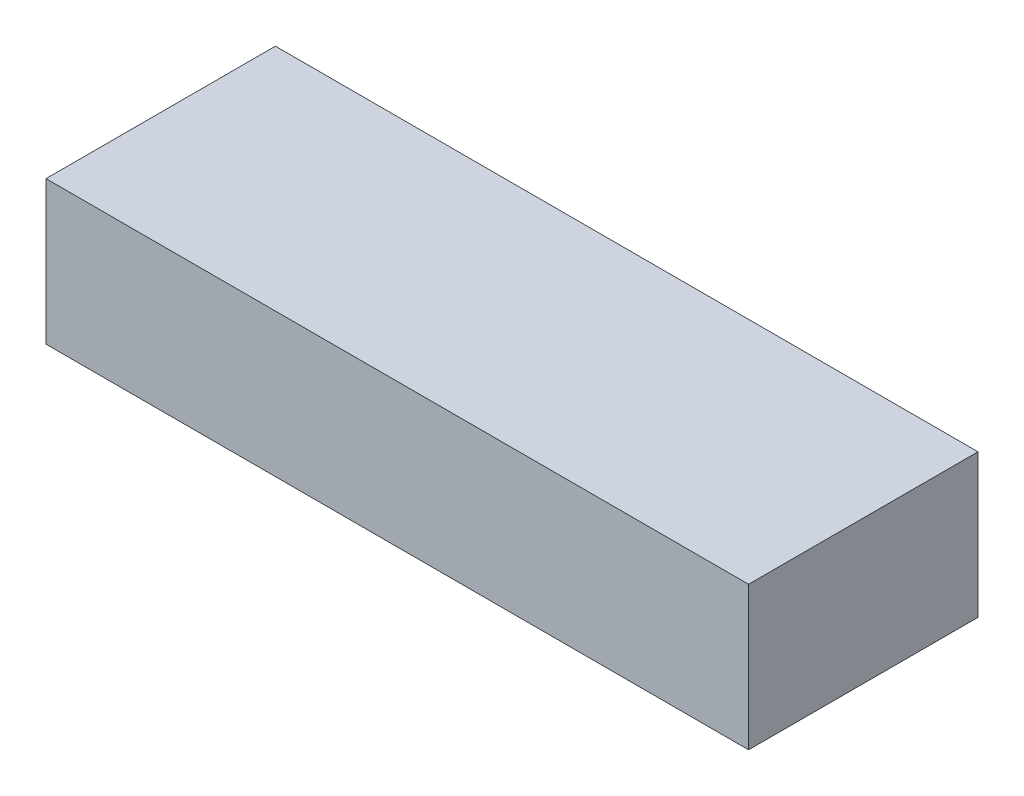
ISO-10303-21;
HEADER;
FILE_DESCRIPTION(('STEP AP214'),'2;1');
FILE_NAME('part.step','',(''),(''),'','','');
FILE_SCHEMA(('AUTOMOTIVE_DESIGN { 1 0 10303 214 1 1 1 1 }'));
ENDSEC;
DATA;
#1=APPLICATION_CONTEXT('core data for automotive mechanical design processes');
#2=APPLICATION_PROTOCOL_DEFINITION('international standard','automotive_design',2000,#1);
#3=PRODUCT_CONTEXT('',#1,'mechanical');
#4=PRODUCT('Part','Part','',(#3));
#5=PRODUCT_RELATED_PRODUCT_CATEGORY('part','',(#4));
#6=PRODUCT_DEFINITION_FORMATION('','',#4);
#7=PRODUCT_DEFINITION_CONTEXT('part definition',#1,'design');
#8=PRODUCT_DEFINITION('design','',#6,#7);
#9=PRODUCT_DEFINITION_SHAPE('','',#8);
#10=(LENGTH_UNIT() NAMED_UNIT(*) SI_UNIT(.MILLI.,.METRE.));
#11=(NAMED_UNIT(*) PLANE_ANGLE_UNIT() SI_UNIT($,.RADIAN.));
#12=(NAMED_UNIT(*) SI_UNIT($,.STERADIAN.) SOLID_ANGLE_UNIT());
#13=UNCERTAINTY_MEASURE_WITH_UNIT(LENGTH_MEASURE(1.E-05),#10,'distance_accuracy_value','');
#14=(GEOMETRIC_REPRESENTATION_CONTEXT(3) GLOBAL_UNCERTAINTY_ASSIGNED_CONTEXT((#13)) GLOBAL_UNIT_ASSIGNED_CONTEXT((#10,
#11,#12)) REPRESENTATION_CONTEXT('',''));
#15=CARTESIAN_POINT('',(0.,0.,0.));
#16=DIRECTION('',(0.,0.,1.));
#17=DIRECTION('',(1.,0.,0.));
#18=AXIS2_PLACEMENT_3D('',#15,#16,#17);
#19=CARTESIAN_POINT('',(0.,10.,0.));
#20=DIRECTION('',(0.,0.,-1.));
#21=DIRECTION('',(-1.,0.,0.));
#22=AXIS2_PLACEMENT_3D('',#19,#20,#21);
#23=PLANE('',#22);
#24=DIRECTION('',(1.,0.,0.));
#25=VECTOR('',#24,1.);
#26=CARTESIAN_POINT('',(0.,0.,0.));
#27=LINE('',#26,#25);
#28=CARTESIAN_POINT('',(0.,0.,0.));
#29=VERTEX_POINT('',#28);
#30=CARTESIAN_POINT('',(49.,0.,0.));
#31=VERTEX_POINT('',#30);
#32=EDGE_CURVE('E96',#29,#31,#27,.T.);
#33=ORIENTED_EDGE('',*,*,#32,.T.);
#34=DIRECTION('',(0.,-1.,0.));
#35=VECTOR('',#34,1.);
#36=CARTESIAN_POINT('',(49.,10.,0.));
#37=LINE('',#36,#35);
#38=CARTESIAN_POINT('',(49.,10.,0.));
#39=VERTEX_POINT('',#38);
#40=EDGE_CURVE('E11',#39,#31,#37,.T.);
#41=ORIENTED_EDGE('',*,*,#40,.F.);
#42=DIRECTION('',(1.,0.,0.));
#43=VECTOR('',#42,1.);
#44=CARTESIAN_POINT('',(0.,10.,0.));
#45=LINE('',#44,#43);
#46=CARTESIAN_POINT('',(0.,10.,0.));
#47=VERTEX_POINT('',#46);
#48=EDGE_CURVE('E82',#47,#39,#45,.T.);
#49=ORIENTED_EDGE('',*,*,#48,.F.);
#50=DIRECTION('',(0.,-1.,0.));
#51=VECTOR('',#50,1.);
#52=CARTESIAN_POINT('',(0.,10.,0.));
#53=LINE('',#52,#51);
#54=EDGE_CURVE('E49',#47,#29,#53,.T.);
#55=ORIENTED_EDGE('',*,*,#54,.T.);
#56=EDGE_LOOP('',(#33,#41,#49,#55));
#57=FACE_BOUND('',#56,.T.);
#58=ADVANCED_FACE('F33',(#57),#23,.F.);
#59=CARTESIAN_POINT('',(49.,10.,0.));
#60=DIRECTION('',(-1.,0.,0.));
#61=DIRECTION('',(0.,0.,1.));
#62=AXIS2_PLACEMENT_3D('',#59,#60,#61);
#63=PLANE('',#62);
#64=DIRECTION('',(0.,0.,-1.));
#65=VECTOR('',#64,1.);
#66=CARTESIAN_POINT('',(49.,0.,0.));
#67=LINE('',#66,#65);
#68=CARTESIAN_POINT('',(49.,0.,-16.));
#69=VERTEX_POINT('',#68);
#70=EDGE_CURVE('E87',#31,#69,#67,.T.);
#71=ORIENTED_EDGE('',*,*,#70,.T.);
#72=DIRECTION('',(0.,-1.,0.));
#73=VECTOR('',#72,1.);
#74=CARTESIAN_POINT('',(49.,10.,-16.));
#75=LINE('',#74,#73);
#76=CARTESIAN_POINT('',(49.,10.,-16.));
#77=VERTEX_POINT('',#76);
#78=EDGE_CURVE('E41',#77,#69,#75,.T.);
#79=ORIENTED_EDGE('',*,*,#78,.F.);
#80=DIRECTION('',(0.,0.,-1.));
#81=VECTOR('',#80,1.);
#82=CARTESIAN_POINT('',(49.,10.,0.));
#83=LINE('',#82,#81);
#84=EDGE_CURVE('E74',#39,#77,#83,.T.);
#85=ORIENTED_EDGE('',*,*,#84,.F.);
#86=ORIENTED_EDGE('',*,*,#40,.T.);
#87=EDGE_LOOP('',(#71,#79,#85,#86));
#88=FACE_BOUND('',#87,.T.);
#89=ADVANCED_FACE('F86',(#88),#63,.F.);
#90=CARTESIAN_POINT('',(0.,10.,-16.));
#91=DIRECTION('',(0.,0.,-1.));
#92=DIRECTION('',(-1.,0.,0.));
#93=AXIS2_PLACEMENT_3D('',#90,#91,#92);
#94=PLANE('',#93);
#95=DIRECTION('',(1.,0.,0.));
#96=VECTOR('',#95,1.);
#97=CARTESIAN_POINT('',(0.,0.,-16.));
#98=LINE('',#97,#96);
#99=CARTESIAN_POINT('',(0.,0.,-16.));
#100=VERTEX_POINT('',#99);
#101=EDGE_CURVE('E99',#100,#69,#98,.T.);
#102=ORIENTED_EDGE('',*,*,#101,.F.);
#103=DIRECTION('',(0.,-1.,0.));
#104=VECTOR('',#103,1.);
#105=CARTESIAN_POINT('',(0.,10.,-16.));
#106=LINE('',#105,#104);
#107=CARTESIAN_POINT('',(0.,10.,-16.));
#108=VERTEX_POINT('',#107);
#109=EDGE_CURVE('E63',#108,#100,#106,.T.);
#110=ORIENTED_EDGE('',*,*,#109,.F.);
#111=DIRECTION('',(1.,0.,0.));
#112=VECTOR('',#111,1.);
#113=CARTESIAN_POINT('',(0.,10.,-16.));
#114=LINE('',#113,#112);
#115=EDGE_CURVE('E81',#108,#77,#114,.T.);
#116=ORIENTED_EDGE('',*,*,#115,.T.);
#117=ORIENTED_EDGE('',*,*,#78,.T.);
#118=EDGE_LOOP('',(#102,#110,#116,#117));
#119=FACE_BOUND('',#118,.T.);
#120=ADVANCED_FACE('F90',(#119),#94,.T.);
#121=CARTESIAN_POINT('',(0.,10.,0.));
#122=DIRECTION('',(-1.,0.,0.));
#123=DIRECTION('',(0.,0.,1.));
#124=AXIS2_PLACEMENT_3D('',#121,#122,#123);
#125=PLANE('',#124);
#126=DIRECTION('',(0.,0.,-1.));
#127=VECTOR('',#126,1.);
#128=CARTESIAN_POINT('',(0.,0.,0.));
#129=LINE('',#128,#127);
#130=EDGE_CURVE('E101',#29,#100,#129,.T.);
#131=ORIENTED_EDGE('',*,*,#130,.F.);
#132=ORIENTED_EDGE('',*,*,#54,.F.);
#133=DIRECTION('',(0.,0.,-1.));
#134=VECTOR('',#133,1.);
#135=CARTESIAN_POINT('',(0.,10.,0.));
#136=LINE('',#135,#134);
#137=EDGE_CURVE('E91',#47,#108,#136,.T.);
#138=ORIENTED_EDGE('',*,*,#137,.T.);
#139=ORIENTED_EDGE('',*,*,#109,.T.);
#140=EDGE_LOOP('',(#131,#132,#138,#139));
#141=FACE_BOUND('',#140,.T.);
#142=ADVANCED_FACE('F107',(#141),#125,.T.);
#143=CARTESIAN_POINT('',(0.,10.,0.));
#144=DIRECTION('',(0.,1.,0.));
#145=DIRECTION('',(0.,0.,1.));
#146=AXIS2_PLACEMENT_3D('',#143,#144,#145);
#147=PLANE('',#146);
#148=ORIENTED_EDGE('',*,*,#48,.T.);
#149=ORIENTED_EDGE('',*,*,#84,.T.);
#150=ORIENTED_EDGE('',*,*,#115,.F.);
#151=ORIENTED_EDGE('',*,*,#137,.F.);
#152=EDGE_LOOP('',(#148,#149,#150,#151));
#153=FACE_BOUND('',#152,.T.);
#154=ADVANCED_FACE('F78',(#153),#147,.T.);
#155=CARTESIAN_POINT('',(0.,0.,0.));
#156=DIRECTION('',(0.,1.,0.));
#157=DIRECTION('',(0.,0.,1.));
#158=AXIS2_PLACEMENT_3D('',#155,#156,#157);
#159=PLANE('',#158);
#160=ORIENTED_EDGE('',*,*,#32,.F.);
#161=ORIENTED_EDGE('',*,*,#130,.T.);
#162=ORIENTED_EDGE('',*,*,#101,.T.);
#163=ORIENTED_EDGE('',*,*,#70,.F.);
#164=EDGE_LOOP('',(#160,#161,#162,#163));
#165=FACE_BOUND('',#164,.T.);
#166=ADVANCED_FACE('F106',(#165),#159,.F.);
#167=CLOSED_SHELL('',(#58,#89,#120,#142,#154,#166));
#168=MANIFOLD_SOLID_BREP('B2',#167);
#169=ADVANCED_BREP_SHAPE_REPRESENTATION('',(#18,#168),#14);
#170=SHAPE_DEFINITION_REPRESENTATION(#9,#169);
ENDSEC;
END-ISO-10303-21;
